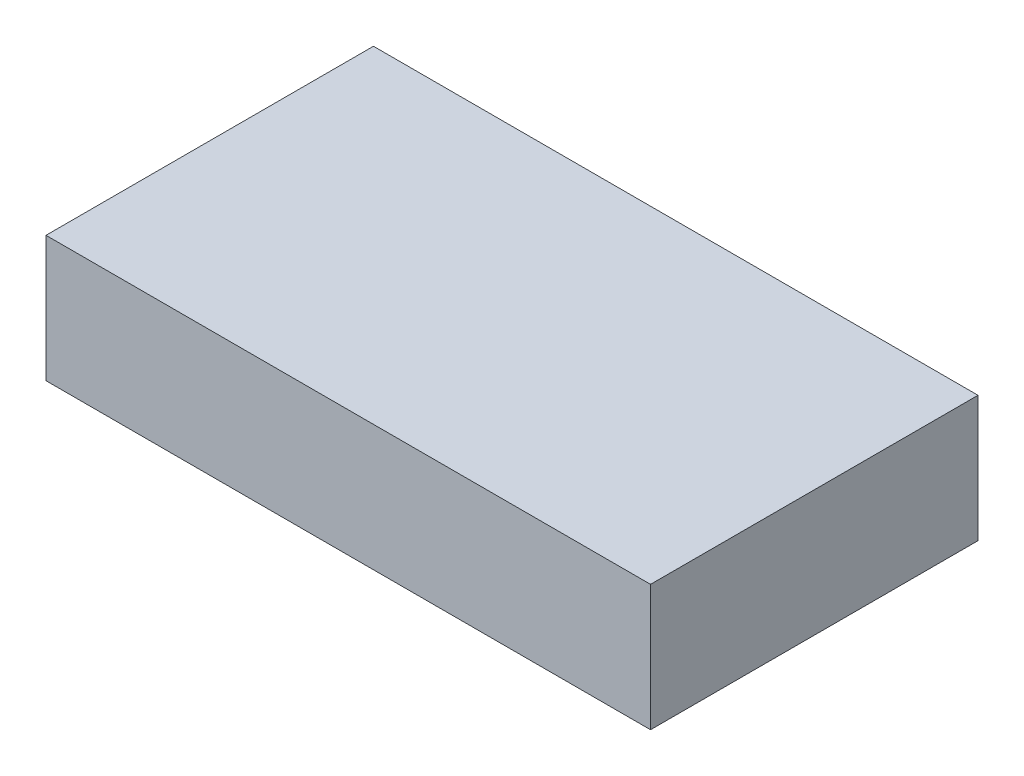
ISO-10303-21;
HEADER;
FILE_DESCRIPTION(('STEP AP214'),'2;1');
FILE_NAME('part.step','',(''),(''),'','','');
FILE_SCHEMA(('AUTOMOTIVE_DESIGN { 1 0 10303 214 1 1 1 1 }'));
ENDSEC;
DATA;
#1=APPLICATION_CONTEXT('core data for automotive mechanical design processes');
#2=APPLICATION_PROTOCOL_DEFINITION('international standard','automotive_design',2000,#1);
#3=PRODUCT_CONTEXT('',#1,'mechanical');
#4=PRODUCT('Part','Part','',(#3));
#5=PRODUCT_RELATED_PRODUCT_CATEGORY('part','',(#4));
#6=PRODUCT_DEFINITION_FORMATION('','',#4);
#7=PRODUCT_DEFINITION_CONTEXT('part definition',#1,'design');
#8=PRODUCT_DEFINITION('design','',#6,#7);
#9=PRODUCT_DEFINITION_SHAPE('','',#8);
#10=(LENGTH_UNIT() NAMED_UNIT(*) SI_UNIT(.MILLI.,.METRE.));
#11=(NAMED_UNIT(*) PLANE_ANGLE_UNIT() SI_UNIT($,.RADIAN.));
#12=(NAMED_UNIT(*) SI_UNIT($,.STERADIAN.) SOLID_ANGLE_UNIT());
#13=UNCERTAINTY_MEASURE_WITH_UNIT(LENGTH_MEASURE(1.E-05),#10,'distance_accuracy_value','');
#14=(GEOMETRIC_REPRESENTATION_CONTEXT(3) GLOBAL_UNCERTAINTY_ASSIGNED_CONTEXT((#13)) GLOBAL_UNIT_ASSIGNED_CONTEXT((#10,
#11,#12)) REPRESENTATION_CONTEXT('',''));
#15=CARTESIAN_POINT('',(0.,0.,0.));
#16=DIRECTION('',(0.,0.,1.));
#17=DIRECTION('',(1.,0.,0.));
#18=AXIS2_PLACEMENT_3D('',#15,#16,#17);
#19=CARTESIAN_POINT('',(12.,2.5,6.5));
#20=DIRECTION('',(-1.,0.,0.));
#21=DIRECTION('',(0.,0.,1.));
#22=AXIS2_PLACEMENT_3D('',#19,#20,#21);
#23=PLANE('',#22);
#24=DIRECTION('',(0.,0.,-1.));
#25=VECTOR('',#24,1.);
#26=CARTESIAN_POINT('',(12.,-2.5,6.5));
#27=LINE('',#26,#25);
#28=CARTESIAN_POINT('',(12.,-2.5,6.5));
#29=VERTEX_POINT('',#28);
#30=CARTESIAN_POINT('',(12.,-2.5,-6.5));
#31=VERTEX_POINT('',#30);
#32=EDGE_CURVE('E111',#29,#31,#27,.T.);
#33=ORIENTED_EDGE('',*,*,#32,.T.);
#34=DIRECTION('',(0.,-1.,0.));
#35=VECTOR('',#34,1.);
#36=CARTESIAN_POINT('',(12.,2.5,-6.5));
#37=LINE('',#36,#35);
#38=CARTESIAN_POINT('',(12.,2.5,-6.5));
#39=VERTEX_POINT('',#38);
#40=EDGE_CURVE('E11',#39,#31,#37,.T.);
#41=ORIENTED_EDGE('',*,*,#40,.F.);
#42=DIRECTION('',(0.,0.,-1.));
#43=VECTOR('',#42,1.);
#44=CARTESIAN_POINT('',(12.,2.5,6.5));
#45=LINE('',#44,#43);
#46=CARTESIAN_POINT('',(12.,2.5,6.5));
#47=VERTEX_POINT('',#46);
#48=EDGE_CURVE('E95',#47,#39,#45,.T.);
#49=ORIENTED_EDGE('',*,*,#48,.F.);
#50=DIRECTION('',(0.,-1.,0.));
#51=VECTOR('',#50,1.);
#52=CARTESIAN_POINT('',(12.,2.5,6.5));
#53=LINE('',#52,#51);
#54=EDGE_CURVE('E107',#47,#29,#53,.T.);
#55=ORIENTED_EDGE('',*,*,#54,.T.);
#56=EDGE_LOOP('',(#33,#41,#49,#55));
#57=FACE_BOUND('',#56,.T.);
#58=ADVANCED_FACE('F43',(#57),#23,.F.);
#59=CARTESIAN_POINT('',(-12.,2.5,-6.5));
#60=DIRECTION('',(0.,0.,1.));
#61=DIRECTION('',(1.,0.,0.));
#62=AXIS2_PLACEMENT_3D('',#59,#60,#61);
#63=PLANE('',#62);
#64=DIRECTION('',(-1.,0.,0.));
#65=VECTOR('',#64,1.);
#66=CARTESIAN_POINT('',(-12.,-2.5,-6.5));
#67=LINE('',#66,#65);
#68=CARTESIAN_POINT('',(-12.,-2.5,-6.5));
#69=VERTEX_POINT('',#68);
#70=EDGE_CURVE('E100',#31,#69,#67,.T.);
#71=ORIENTED_EDGE('',*,*,#70,.T.);
#72=DIRECTION('',(0.,-1.,0.));
#73=VECTOR('',#72,1.);
#74=CARTESIAN_POINT('',(-12.,2.5,-6.5));
#75=LINE('',#74,#73);
#76=CARTESIAN_POINT('',(-12.,2.5,-6.5));
#77=VERTEX_POINT('',#76);
#78=EDGE_CURVE('E52',#77,#69,#75,.T.);
#79=ORIENTED_EDGE('',*,*,#78,.F.);
#80=DIRECTION('',(-1.,0.,0.));
#81=VECTOR('',#80,1.);
#82=CARTESIAN_POINT('',(-12.,2.5,-6.5));
#83=LINE('',#82,#81);
#84=EDGE_CURVE('E90',#39,#77,#83,.T.);
#85=ORIENTED_EDGE('',*,*,#84,.F.);
#86=ORIENTED_EDGE('',*,*,#40,.T.);
#87=EDGE_LOOP('',(#71,#79,#85,#86));
#88=FACE_BOUND('',#87,.T.);
#89=ADVANCED_FACE('F99',(#88),#63,.F.);
#90=CARTESIAN_POINT('',(-12.,2.5,6.5));
#91=DIRECTION('',(1.,0.,0.));
#92=DIRECTION('',(0.,0.,-1.));
#93=AXIS2_PLACEMENT_3D('',#90,#91,#92);
#94=PLANE('',#93);
#95=DIRECTION('',(0.,0.,1.));
#96=VECTOR('',#95,1.);
#97=CARTESIAN_POINT('',(-12.,-2.5,6.5));
#98=LINE('',#97,#96);
#99=CARTESIAN_POINT('',(-12.,-2.5,6.5));
#100=VERTEX_POINT('',#99);
#101=EDGE_CURVE('E77',#69,#100,#98,.T.);
#102=ORIENTED_EDGE('',*,*,#101,.T.);
#103=DIRECTION('',(0.,-1.,0.));
#104=VECTOR('',#103,1.);
#105=CARTESIAN_POINT('',(-12.,2.5,6.5));
#106=LINE('',#105,#104);
#107=CARTESIAN_POINT('',(-12.,2.5,6.5));
#108=VERTEX_POINT('',#107);
#109=EDGE_CURVE('E102',#108,#100,#106,.T.);
#110=ORIENTED_EDGE('',*,*,#109,.F.);
#111=DIRECTION('',(0.,0.,1.));
#112=VECTOR('',#111,1.);
#113=CARTESIAN_POINT('',(-12.,2.5,6.5));
#114=LINE('',#113,#112);
#115=EDGE_CURVE('E93',#77,#108,#114,.T.);
#116=ORIENTED_EDGE('',*,*,#115,.F.);
#117=ORIENTED_EDGE('',*,*,#78,.T.);
#118=EDGE_LOOP('',(#102,#110,#116,#117));
#119=FACE_BOUND('',#118,.T.);
#120=ADVANCED_FACE('F103',(#119),#94,.F.);
#121=CARTESIAN_POINT('',(-12.,2.5,6.5));
#122=DIRECTION('',(0.,0.,-1.));
#123=DIRECTION('',(-1.,0.,0.));
#124=AXIS2_PLACEMENT_3D('',#121,#122,#123);
#125=PLANE('',#124);
#126=DIRECTION('',(1.,0.,0.));
#127=VECTOR('',#126,1.);
#128=CARTESIAN_POINT('',(-12.,-2.5,6.5));
#129=LINE('',#128,#127);
#130=EDGE_CURVE('E83',#100,#29,#129,.T.);
#131=ORIENTED_EDGE('',*,*,#130,.T.);
#132=ORIENTED_EDGE('',*,*,#54,.F.);
#133=DIRECTION('',(1.,0.,0.));
#134=VECTOR('',#133,1.);
#135=CARTESIAN_POINT('',(-12.,2.5,6.5));
#136=LINE('',#135,#134);
#137=EDGE_CURVE('E60',#108,#47,#136,.T.);
#138=ORIENTED_EDGE('',*,*,#137,.F.);
#139=ORIENTED_EDGE('',*,*,#109,.T.);
#140=EDGE_LOOP('',(#131,#132,#138,#139));
#141=FACE_BOUND('',#140,.T.);
#142=ADVANCED_FACE('F124',(#141),#125,.F.);
#143=CARTESIAN_POINT('',(0.,2.5,0.));
#144=DIRECTION('',(0.,-1.,0.));
#145=DIRECTION('',(0.,0.,-1.));
#146=AXIS2_PLACEMENT_3D('',#143,#144,#145);
#147=PLANE('',#146);
#148=ORIENTED_EDGE('',*,*,#48,.T.);
#149=ORIENTED_EDGE('',*,*,#84,.T.);
#150=ORIENTED_EDGE('',*,*,#115,.T.);
#151=ORIENTED_EDGE('',*,*,#137,.T.);
#152=EDGE_LOOP('',(#148,#149,#150,#151));
#153=FACE_BOUND('',#152,.T.);
#154=ADVANCED_FACE('F91',(#153),#147,.F.);
#155=CARTESIAN_POINT('',(0.,-2.5,0.));
#156=DIRECTION('',(0.,-1.,0.));
#157=DIRECTION('',(0.,0.,-1.));
#158=AXIS2_PLACEMENT_3D('',#155,#156,#157);
#159=PLANE('',#158);
#160=ORIENTED_EDGE('',*,*,#32,.F.);
#161=ORIENTED_EDGE('',*,*,#130,.F.);
#162=ORIENTED_EDGE('',*,*,#101,.F.);
#163=ORIENTED_EDGE('',*,*,#70,.F.);
#164=EDGE_LOOP('',(#160,#161,#162,#163));
#165=FACE_BOUND('',#164,.T.);
#166=ADVANCED_FACE('F127',(#165),#159,.T.);
#167=CLOSED_SHELL('',(#58,#89,#120,#142,#154,#166));
#168=MANIFOLD_SOLID_BREP('B2',#167);
#169=ADVANCED_BREP_SHAPE_REPRESENTATION('',(#18,#168),#14);
#170=SHAPE_DEFINITION_REPRESENTATION(#9,#169);
ENDSEC;
END-ISO-10303-21;
